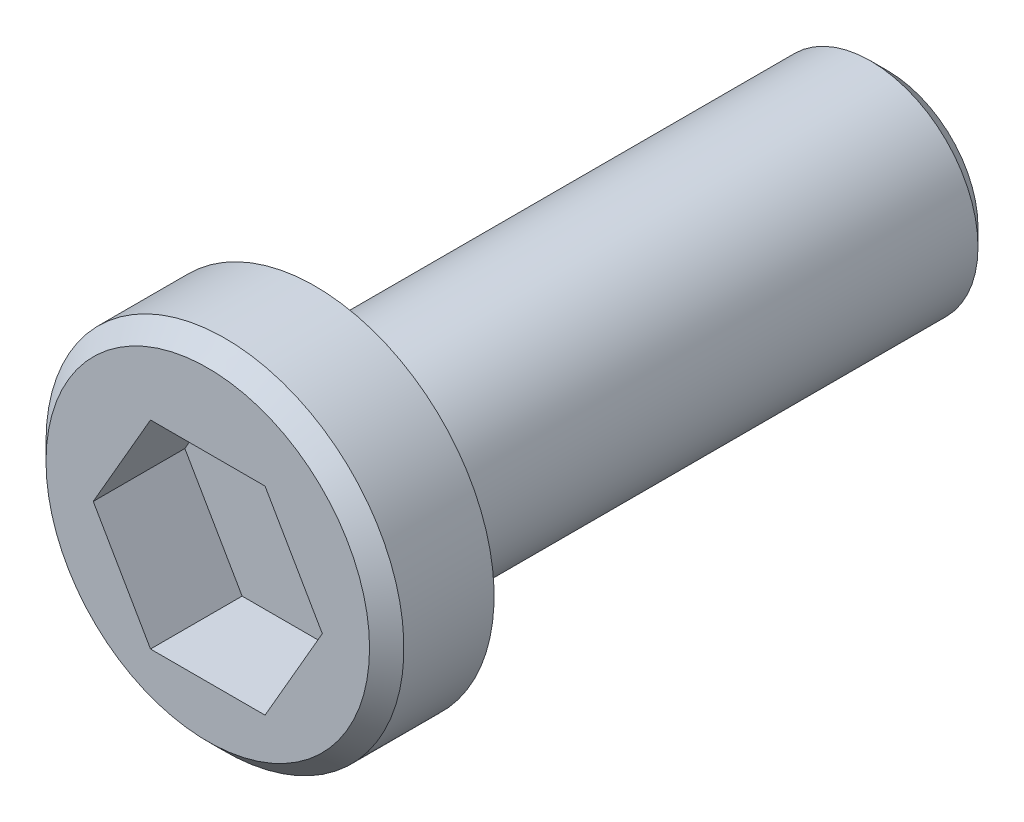
ISO-10303-21;
HEADER;
FILE_DESCRIPTION(('STEP AP214'),'2;1');
FILE_NAME('part.step','',(''),(''),'','','');
FILE_SCHEMA(('AUTOMOTIVE_DESIGN { 1 0 10303 214 1 1 1 1 }'));
ENDSEC;
DATA;
#1=APPLICATION_CONTEXT('core data for automotive mechanical design processes');
#2=APPLICATION_PROTOCOL_DEFINITION('international standard','automotive_design',2000,#1);
#3=PRODUCT_CONTEXT('',#1,'mechanical');
#4=PRODUCT('Part','Part','',(#3));
#5=PRODUCT_RELATED_PRODUCT_CATEGORY('part','',(#4));
#6=PRODUCT_DEFINITION_FORMATION('','',#4);
#7=PRODUCT_DEFINITION_CONTEXT('part definition',#1,'design');
#8=PRODUCT_DEFINITION('design','',#6,#7);
#9=PRODUCT_DEFINITION_SHAPE('','',#8);
#10=(LENGTH_UNIT() NAMED_UNIT(*) SI_UNIT(.MILLI.,.METRE.));
#11=(NAMED_UNIT(*) PLANE_ANGLE_UNIT() SI_UNIT($,.RADIAN.));
#12=(NAMED_UNIT(*) SI_UNIT($,.STERADIAN.) SOLID_ANGLE_UNIT());
#13=UNCERTAINTY_MEASURE_WITH_UNIT(LENGTH_MEASURE(1.E-05),#10,'distance_accuracy_value','');
#14=(GEOMETRIC_REPRESENTATION_CONTEXT(3) GLOBAL_UNCERTAINTY_ASSIGNED_CONTEXT((#13)) GLOBAL_UNIT_ASSIGNED_CONTEXT((#10,
#11,#12)) REPRESENTATION_CONTEXT('',''));
#15=CARTESIAN_POINT('',(0.,0.,0.));
#16=DIRECTION('',(0.,0.,1.));
#17=DIRECTION('',(1.,0.,0.));
#18=AXIS2_PLACEMENT_3D('',#15,#16,#17);
#19=CARTESIAN_POINT('',(0.,0.,25.4));
#20=DIRECTION('',(0.,0.,-1.));
#21=DIRECTION('',(-1.,0.,0.));
#22=AXIS2_PLACEMENT_3D('',#19,#20,#21);
#23=CYLINDRICAL_SURFACE('',#22,4.7625);
#24=CARTESIAN_POINT('',(0.,0.,0.761999999999999));
#25=DIRECTION('',(0.,0.,1.));
#26=DIRECTION('',(1.,0.,0.));
#27=AXIS2_PLACEMENT_3D('',#24,#25,#26);
#28=CIRCLE('',#27,4.7625);
#29=CARTESIAN_POINT('',(4.7625,0.,0.761999999999999));
#30=VERTEX_POINT('',#29);
#31=EDGE_CURVE('E147',#30,#30,#28,.T.);
#32=ORIENTED_EDGE('',*,*,#31,.T.);
#33=EDGE_LOOP('',(#32));
#34=FACE_BOUND('',#33,.T.);
#35=CARTESIAN_POINT('',(0.,0.,25.4));
#36=DIRECTION('',(0.,0.,1.));
#37=DIRECTION('',(1.,0.,0.));
#38=AXIS2_PLACEMENT_3D('',#35,#36,#37);
#39=CIRCLE('',#38,4.7625);
#40=CARTESIAN_POINT('',(4.7625,0.,25.4));
#41=VERTEX_POINT('',#40);
#42=EDGE_CURVE('E144',#41,#41,#39,.T.);
#43=ORIENTED_EDGE('',*,*,#42,.F.);
#44=EDGE_LOOP('',(#43));
#45=FACE_BOUND('',#44,.T.);
#46=ADVANCED_FACE('F34',(#34,#45),#23,.T.);
#47=CARTESIAN_POINT('',(0.,0.,0.));
#48=DIRECTION('',(0.,0.,1.));
#49=DIRECTION('',(1.,0.,0.));
#50=AXIS2_PLACEMENT_3D('',#47,#48,#49);
#51=PLANE('',#50);
#52=CARTESIAN_POINT('',(0.,0.,0.));
#53=DIRECTION('',(0.,0.,1.));
#54=DIRECTION('',(1.,0.,0.));
#55=AXIS2_PLACEMENT_3D('',#52,#53,#54);
#56=CIRCLE('',#55,4.0005);
#57=CARTESIAN_POINT('',(4.0005,0.,0.));
#58=VERTEX_POINT('',#57);
#59=EDGE_CURVE('E150',#58,#58,#56,.F.);
#60=ORIENTED_EDGE('',*,*,#59,.T.);
#61=EDGE_LOOP('',(#60));
#62=FACE_BOUND('',#61,.T.);
#63=ADVANCED_FACE('F170',(#62),#51,.F.);
#64=CARTESIAN_POINT('',(0.,0.491553117569765,25.4));
#65=DIRECTION('',(0.,0.,1.));
#66=DIRECTION('',(1.,0.,0.));
#67=AXIS2_PLACEMENT_3D('',#64,#65,#66);
#68=PLANE('',#67);
#69=CARTESIAN_POINT('',(0.,0.491553117569765,25.4));
#70=DIRECTION('',(0.,0.,1.));
#71=DIRECTION('',(1.,0.,0.));
#72=AXIS2_PLACEMENT_3D('',#69,#70,#71);
#73=CIRCLE('',#72,7.9375);
#74=CARTESIAN_POINT('',(-7.9375,0.491553117569765,25.4));
#75=VERTEX_POINT('',#74);
#76=EDGE_CURVE('E136',#75,#75,#73,.T.);
#77=ORIENTED_EDGE('',*,*,#76,.F.);
#78=EDGE_LOOP('',(#77));
#79=FACE_BOUND('',#78,.T.);
#80=ORIENTED_EDGE('',*,*,#42,.T.);
#81=EDGE_LOOP('',(#80));
#82=FACE_BOUND('',#81,.T.);
#83=ADVANCED_FACE('F176',(#79,#82),#68,.F.);
#84=CARTESIAN_POINT('',(0.,0.491553117569765,30.1625));
#85=DIRECTION('',(0.,0.,-1.));
#86=DIRECTION('',(-1.,0.,0.));
#87=AXIS2_PLACEMENT_3D('',#84,#85,#86);
#88=CYLINDRICAL_SURFACE('',#87,7.9375);
#89=CARTESIAN_POINT('',(0.,0.491553117569765,29.4005));
#90=DIRECTION('',(0.,0.,1.));
#91=DIRECTION('',(1.,0.,0.));
#92=AXIS2_PLACEMENT_3D('',#89,#90,#91);
#93=CIRCLE('',#92,7.9375);
#94=CARTESIAN_POINT('',(-7.9375,0.491553117569765,29.4005));
#95=VERTEX_POINT('',#94);
#96=EDGE_CURVE('E11',#95,#95,#93,.F.);
#97=CARTESIAN_POINT('',(-7.9375,0.491553117569765,29.4005));
#98=CARTESIAN_POINT('',(-7.9375,0.491553117569765,29.358828125));
#99=CARTESIAN_POINT('',(-7.9375,0.491553117569765,29.31715625));
#100=CARTESIAN_POINT('',(-7.9375,0.491553117569765,29.2338125));
#101=CARTESIAN_POINT('',(-7.9375,0.491553117569765,29.192140625));
#102=CARTESIAN_POINT('',(-7.9375,0.491553117569765,29.108796875));
#103=CARTESIAN_POINT('',(-7.9375,0.491553117569765,29.067125));
#104=CARTESIAN_POINT('',(-7.9375,0.491553117569765,28.98378125));
#105=CARTESIAN_POINT('',(-7.9375,0.491553117569765,28.942109375));
#106=CARTESIAN_POINT('',(-7.9375,0.491553117569765,28.858765625));
#107=CARTESIAN_POINT('',(-7.9375,0.491553117569765,28.81709375));
#108=CARTESIAN_POINT('',(-7.9375,0.491553117569765,28.73375));
#109=CARTESIAN_POINT('',(-7.9375,0.491553117569765,28.692078125));
#110=CARTESIAN_POINT('',(-7.9375,0.491553117569765,28.608734375));
#111=CARTESIAN_POINT('',(-7.9375,0.491553117569765,28.5670625));
#112=CARTESIAN_POINT('',(-7.9375,0.491553117569765,28.48371875));
#113=CARTESIAN_POINT('',(-7.9375,0.491553117569765,28.442046875));
#114=CARTESIAN_POINT('',(-7.9375,0.491553117569765,28.358703125));
#115=CARTESIAN_POINT('',(-7.9375,0.491553117569765,28.31703125));
#116=CARTESIAN_POINT('',(-7.9375,0.491553117569765,28.2336875));
#117=CARTESIAN_POINT('',(-7.9375,0.491553117569765,28.192015625));
#118=CARTESIAN_POINT('',(-7.9375,0.491553117569765,28.108671875));
#119=CARTESIAN_POINT('',(-7.9375,0.491553117569765,28.067));
#120=CARTESIAN_POINT('',(-7.9375,0.491553117569765,27.98365625));
#121=CARTESIAN_POINT('',(-7.9375,0.491553117569765,27.941984375));
#122=CARTESIAN_POINT('',(-7.9375,0.491553117569765,27.858640625));
#123=CARTESIAN_POINT('',(-7.9375,0.491553117569765,27.81696875));
#124=CARTESIAN_POINT('',(-7.9375,0.491553117569765,27.733625));
#125=CARTESIAN_POINT('',(-7.9375,0.491553117569765,27.691953125));
#126=CARTESIAN_POINT('',(-7.9375,0.491553117569765,27.608609375));
#127=CARTESIAN_POINT('',(-7.9375,0.491553117569765,27.5669375));
#128=CARTESIAN_POINT('',(-7.9375,0.491553117569765,27.48359375));
#129=CARTESIAN_POINT('',(-7.9375,0.491553117569765,27.441921875));
#130=CARTESIAN_POINT('',(-7.9375,0.491553117569765,27.358578125));
#131=CARTESIAN_POINT('',(-7.9375,0.491553117569765,27.31690625));
#132=CARTESIAN_POINT('',(-7.9375,0.491553117569765,27.2335625));
#133=CARTESIAN_POINT('',(-7.9375,0.491553117569765,27.191890625));
#134=CARTESIAN_POINT('',(-7.9375,0.491553117569765,27.108546875));
#135=CARTESIAN_POINT('',(-7.9375,0.491553117569765,27.066875));
#136=CARTESIAN_POINT('',(-7.9375,0.491553117569765,26.98353125));
#137=CARTESIAN_POINT('',(-7.9375,0.491553117569765,26.941859375));
#138=CARTESIAN_POINT('',(-7.9375,0.491553117569765,26.858515625));
#139=CARTESIAN_POINT('',(-7.9375,0.491553117569765,26.81684375));
#140=CARTESIAN_POINT('',(-7.9375,0.491553117569765,26.7335));
#141=CARTESIAN_POINT('',(-7.9375,0.491553117569765,26.691828125));
#142=CARTESIAN_POINT('',(-7.9375,0.491553117569765,26.608484375));
#143=CARTESIAN_POINT('',(-7.9375,0.491553117569765,26.5668125));
#144=CARTESIAN_POINT('',(-7.9375,0.491553117569765,26.48346875));
#145=CARTESIAN_POINT('',(-7.9375,0.491553117569765,26.441796875));
#146=CARTESIAN_POINT('',(-7.9375,0.491553117569765,26.358453125));
#147=CARTESIAN_POINT('',(-7.9375,0.491553117569765,26.31678125));
#148=CARTESIAN_POINT('',(-7.9375,0.491553117569765,26.2334375));
#149=CARTESIAN_POINT('',(-7.9375,0.491553117569765,26.191765625));
#150=CARTESIAN_POINT('',(-7.9375,0.491553117569765,26.108421875));
#151=CARTESIAN_POINT('',(-7.9375,0.491553117569765,26.06675));
#152=CARTESIAN_POINT('',(-7.9375,0.491553117569765,25.98340625));
#153=CARTESIAN_POINT('',(-7.9375,0.491553117569765,25.941734375));
#154=CARTESIAN_POINT('',(-7.9375,0.491553117569765,25.858390625));
#155=CARTESIAN_POINT('',(-7.9375,0.491553117569765,25.81671875));
#156=CARTESIAN_POINT('',(-7.9375,0.491553117569765,25.733375));
#157=CARTESIAN_POINT('',(-7.9375,0.491553117569765,25.691703125));
#158=CARTESIAN_POINT('',(-7.9375,0.491553117569765,25.608359375));
#159=CARTESIAN_POINT('',(-7.9375,0.491553117569765,25.5666875));
#160=CARTESIAN_POINT('',(-7.9375,0.491553117569765,25.48334375));
#161=CARTESIAN_POINT('',(-7.9375,0.491553117569765,25.441671875));
#162=CARTESIAN_POINT('',(-7.9375,0.491553117569765,25.4));
#163=B_SPLINE_CURVE_WITH_KNOTS('',3,(#97,#98,#99,#100,#101,#102,#103,#104,#105,#106,#107,#108,
#109,#110,#111,#112,#113,#114,#115,#116,#117,#118,#119,#120,#121,#122,#123,#124,#125,#126,#127,
#128,#129,#130,#131,#132,#133,#134,#135,#136,#137,#138,#139,#140,#141,#142,#143,#144,#145,#146,
#147,#148,#149,#150,#151,#152,#153,#154,#155,#156,#157,#158,#159,#160,#161,#162),.UNSPECIFIED.,
.F.,.F.,(4,2,2,2,2,2,2,2,2,2,2,2,2,2,2,2,2,2,2,2,2,2,2,2,2,2,2,2,2,2,2,2,4),(0.,
0.125015624999999,0.250031249999998,0.375046874999996,0.500062499999999,0.625078124999998,
0.750093749999996,0.875109374999999,1.000125,1.125140625,1.25015625,1.375171875,1.5001875,
1.625203125,1.75021875,1.875234375,2.00025,2.125265625,2.25028125,2.375296875,2.5003125,
2.625328125,2.75034375,2.875359375,3.000375,3.125390625,3.25040625,3.375421875,3.5004375,
3.625453125,3.75046875,3.875484375,4.0005),.UNSPECIFIED.);
#164=EDGE_CURVE('BSEAM181',#95,#75,#163,.T.);
#165=ORIENTED_EDGE('',*,*,#96,.T.);
#166=ORIENTED_EDGE('',*,*,#76,.T.);
#167=ORIENTED_EDGE('',*,*,#164,.T.);
#168=ORIENTED_EDGE('',*,*,#164,.F.);
#169=EDGE_LOOP('',(#165,#167,#166,#168));
#170=FACE_BOUND('',#169,.T.);
#171=ADVANCED_FACE('F181',(#170),#88,.T.);
#172=CARTESIAN_POINT('',(0.,0.491553117569765,30.1625));
#173=DIRECTION('',(0.,0.,1.));
#174=DIRECTION('',(1.,0.,0.));
#175=AXIS2_PLACEMENT_3D('',#172,#173,#174);
#176=PLANE('',#175);
#177=DIRECTION('',(0.499999999999999,0.866025403784439,0.));
#178=VECTOR('',#177,1.);
#179=CARTESIAN_POINT('',(2.54,-4.39940905122495,30.1625));
#180=LINE('',#179,#178);
#181=CARTESIAN_POINT('',(2.54,-4.39940905122495,30.1625));
#182=VERTEX_POINT('',#181);
#183=CARTESIAN_POINT('',(5.08,0.,30.1625));
#184=VERTEX_POINT('',#183);
#185=EDGE_CURVE('E49',#182,#184,#180,.T.);
#186=ORIENTED_EDGE('',*,*,#185,.F.);
#187=DIRECTION('',(1.,0.,0.));
#188=VECTOR('',#187,1.);
#189=CARTESIAN_POINT('',(-2.54,-4.39940905122495,30.1625));
#190=LINE('',#189,#188);
#191=CARTESIAN_POINT('',(-2.54,-4.39940905122495,30.1625));
#192=VERTEX_POINT('',#191);
#193=EDGE_CURVE('E132',#192,#182,#190,.T.);
#194=ORIENTED_EDGE('',*,*,#193,.F.);
#195=DIRECTION('',(0.5,-0.866025403784438,0.));
#196=VECTOR('',#195,1.);
#197=CARTESIAN_POINT('',(-5.08,0.,30.1625));
#198=LINE('',#197,#196);
#199=CARTESIAN_POINT('',(-5.08,0.,30.1625));
#200=VERTEX_POINT('',#199);
#201=EDGE_CURVE('E130',#200,#192,#198,.T.);
#202=ORIENTED_EDGE('',*,*,#201,.F.);
#203=DIRECTION('',(-0.5,-0.866025403784439,0.));
#204=VECTOR('',#203,1.);
#205=CARTESIAN_POINT('',(-2.54,4.39940905122495,30.1625));
#206=LINE('',#205,#204);
#207=CARTESIAN_POINT('',(-2.54,4.39940905122495,30.1625));
#208=VERTEX_POINT('',#207);
#209=EDGE_CURVE('E97',#208,#200,#206,.T.);
#210=ORIENTED_EDGE('',*,*,#209,.F.);
#211=DIRECTION('',(-1.,0.,0.));
#212=VECTOR('',#211,1.);
#213=CARTESIAN_POINT('',(2.54,4.39940905122495,30.1625));
#214=LINE('',#213,#212);
#215=CARTESIAN_POINT('',(2.54,4.39940905122495,30.1625));
#216=VERTEX_POINT('',#215);
#217=EDGE_CURVE('E126',#216,#208,#214,.T.);
#218=ORIENTED_EDGE('',*,*,#217,.F.);
#219=DIRECTION('',(-0.5,0.866025403784438,0.));
#220=VECTOR('',#219,1.);
#221=CARTESIAN_POINT('',(5.08,0.,30.1625));
#222=LINE('',#221,#220);
#223=EDGE_CURVE('E123',#184,#216,#222,.T.);
#224=ORIENTED_EDGE('',*,*,#223,.F.);
#225=EDGE_LOOP('',(#186,#194,#202,#210,#218,#224));
#226=FACE_BOUND('',#225,.T.);
#227=CARTESIAN_POINT('',(0.,0.491553117569765,30.1625));
#228=DIRECTION('',(0.,0.,1.));
#229=DIRECTION('',(1.,0.,0.));
#230=AXIS2_PLACEMENT_3D('',#227,#228,#229);
#231=CIRCLE('',#230,7.1755);
#232=CARTESIAN_POINT('',(7.1755,0.491553117569765,30.1625));
#233=VERTEX_POINT('',#232);
#234=EDGE_CURVE('E42',#233,#233,#231,.T.);
#235=ORIENTED_EDGE('',*,*,#234,.T.);
#236=EDGE_LOOP('',(#235));
#237=FACE_BOUND('',#236,.T.);
#238=ADVANCED_FACE('F155',(#226,#237),#176,.T.);
#239=CARTESIAN_POINT('',(0.,0.,0.761999999999999));
#240=DIRECTION('',(0.,0.,1.));
#241=DIRECTION('',(1.,0.,0.));
#242=AXIS2_PLACEMENT_3D('',#239,#240,#241);
#243=CONICAL_SURFACE('',#242,4.7625,0.78539816339745);
#244=ORIENTED_EDGE('',*,*,#59,.F.);
#245=EDGE_LOOP('',(#244));
#246=FACE_BOUND('',#245,.T.);
#247=ORIENTED_EDGE('',*,*,#31,.F.);
#248=EDGE_LOOP('',(#247));
#249=FACE_BOUND('',#248,.T.);
#250=ADVANCED_FACE('F159',(#246,#249),#243,.T.);
#251=CARTESIAN_POINT('',(0.,0.491553117569765,30.1625));
#252=DIRECTION('',(0.,0.,-1.));
#253=DIRECTION('',(-1.,0.,0.));
#254=AXIS2_PLACEMENT_3D('',#251,#252,#253);
#255=CONICAL_SURFACE('',#254,7.1755,0.785398163397444);
#256=ORIENTED_EDGE('',*,*,#96,.F.);
#257=EDGE_LOOP('',(#256));
#258=FACE_BOUND('',#257,.T.);
#259=ORIENTED_EDGE('',*,*,#234,.F.);
#260=EDGE_LOOP('',(#259));
#261=FACE_BOUND('',#260,.T.);
#262=ADVANCED_FACE('F36',(#258,#261),#255,.T.);
#263=CARTESIAN_POINT('',(2.54,-4.39940905122495,26.0985));
#264=DIRECTION('',(0.866025403784439,-0.5,0.));
#265=DIRECTION('',(0.5,0.866025403784439,0.));
#266=AXIS2_PLACEMENT_3D('',#263,#264,#265);
#267=PLANE('',#266);
#268=ORIENTED_EDGE('',*,*,#185,.T.);
#269=DIRECTION('',(0.,0.,1.));
#270=VECTOR('',#269,1.);
#271=CARTESIAN_POINT('',(5.08,0.,26.0985));
#272=LINE('',#271,#270);
#273=CARTESIAN_POINT('',(5.08,0.,26.0985));
#274=VERTEX_POINT('',#273);
#275=EDGE_CURVE('E79',#274,#184,#272,.T.);
#276=ORIENTED_EDGE('',*,*,#275,.F.);
#277=DIRECTION('',(0.499999999999999,0.866025403784439,0.));
#278=VECTOR('',#277,1.);
#279=CARTESIAN_POINT('',(2.54,-4.39940905122495,26.0985));
#280=LINE('',#279,#278);
#281=CARTESIAN_POINT('',(2.54,-4.39940905122495,26.0985));
#282=VERTEX_POINT('',#281);
#283=EDGE_CURVE('E134',#282,#274,#280,.T.);
#284=ORIENTED_EDGE('',*,*,#283,.F.);
#285=DIRECTION('',(0.,0.,1.));
#286=VECTOR('',#285,1.);
#287=CARTESIAN_POINT('',(2.54,-4.39940905122495,26.0985));
#288=LINE('',#287,#286);
#289=EDGE_CURVE('E57',#282,#182,#288,.T.);
#290=ORIENTED_EDGE('',*,*,#289,.T.);
#291=EDGE_LOOP('',(#268,#276,#284,#290));
#292=FACE_BOUND('',#291,.T.);
#293=ADVANCED_FACE('F158',(#292),#267,.F.);
#294=CARTESIAN_POINT('',(-2.54,-4.39940905122495,26.0985));
#295=DIRECTION('',(0.,-1.,0.));
#296=DIRECTION('',(1.,0.,0.));
#297=AXIS2_PLACEMENT_3D('',#294,#295,#296);
#298=PLANE('',#297);
#299=ORIENTED_EDGE('',*,*,#193,.T.);
#300=ORIENTED_EDGE('',*,*,#289,.F.);
#301=DIRECTION('',(1.,0.,0.));
#302=VECTOR('',#301,1.);
#303=CARTESIAN_POINT('',(-2.54,-4.39940905122495,26.0985));
#304=LINE('',#303,#302);
#305=CARTESIAN_POINT('',(-2.54,-4.39940905122495,26.0985));
#306=VERTEX_POINT('',#305);
#307=EDGE_CURVE('E109',#306,#282,#304,.T.);
#308=ORIENTED_EDGE('',*,*,#307,.F.);
#309=DIRECTION('',(0.,0.,1.));
#310=VECTOR('',#309,1.);
#311=CARTESIAN_POINT('',(-2.54,-4.39940905122495,26.0985));
#312=LINE('',#311,#310);
#313=EDGE_CURVE('E101',#306,#192,#312,.T.);
#314=ORIENTED_EDGE('',*,*,#313,.T.);
#315=EDGE_LOOP('',(#299,#300,#308,#314));
#316=FACE_BOUND('',#315,.T.);
#317=ADVANCED_FACE('F165',(#316),#298,.F.);
#318=CARTESIAN_POINT('',(-5.08,0.,26.0985));
#319=DIRECTION('',(-0.866025403784439,-0.5,0.));
#320=DIRECTION('',(0.5,-0.866025403784439,0.));
#321=AXIS2_PLACEMENT_3D('',#318,#319,#320);
#322=PLANE('',#321);
#323=ORIENTED_EDGE('',*,*,#201,.T.);
#324=ORIENTED_EDGE('',*,*,#313,.F.);
#325=DIRECTION('',(0.5,-0.866025403784438,0.));
#326=VECTOR('',#325,1.);
#327=CARTESIAN_POINT('',(-5.08,0.,26.0985));
#328=LINE('',#327,#326);
#329=CARTESIAN_POINT('',(-5.08,0.,26.0985));
#330=VERTEX_POINT('',#329);
#331=EDGE_CURVE('E105',#330,#306,#328,.T.);
#332=ORIENTED_EDGE('',*,*,#331,.F.);
#333=DIRECTION('',(0.,0.,1.));
#334=VECTOR('',#333,1.);
#335=CARTESIAN_POINT('',(-5.08,0.,26.0985));
#336=LINE('',#335,#334);
#337=EDGE_CURVE('E90',#330,#200,#336,.T.);
#338=ORIENTED_EDGE('',*,*,#337,.T.);
#339=EDGE_LOOP('',(#323,#324,#332,#338));
#340=FACE_BOUND('',#339,.T.);
#341=ADVANCED_FACE('F106',(#340),#322,.F.);
#342=CARTESIAN_POINT('',(-2.54,4.39940905122495,26.0985));
#343=DIRECTION('',(-0.866025403784439,0.5,0.));
#344=DIRECTION('',(-0.5,-0.866025403784439,0.));
#345=AXIS2_PLACEMENT_3D('',#342,#343,#344);
#346=PLANE('',#345);
#347=ORIENTED_EDGE('',*,*,#209,.T.);
#348=ORIENTED_EDGE('',*,*,#337,.F.);
#349=DIRECTION('',(-0.5,-0.866025403784439,0.));
#350=VECTOR('',#349,1.);
#351=CARTESIAN_POINT('',(-2.54,4.39940905122495,26.0985));
#352=LINE('',#351,#350);
#353=CARTESIAN_POINT('',(-2.54,4.39940905122495,26.0985));
#354=VERTEX_POINT('',#353);
#355=EDGE_CURVE('E94',#354,#330,#352,.T.);
#356=ORIENTED_EDGE('',*,*,#355,.F.);
#357=DIRECTION('',(0.,0.,1.));
#358=VECTOR('',#357,1.);
#359=CARTESIAN_POINT('',(-2.54,4.39940905122495,26.0985));
#360=LINE('',#359,#358);
#361=EDGE_CURVE('E102',#354,#208,#360,.T.);
#362=ORIENTED_EDGE('',*,*,#361,.T.);
#363=EDGE_LOOP('',(#347,#348,#356,#362));
#364=FACE_BOUND('',#363,.T.);
#365=ADVANCED_FACE('F92',(#364),#346,.F.);
#366=CARTESIAN_POINT('',(2.54,4.39940905122495,26.0985));
#367=DIRECTION('',(0.,1.,0.));
#368=DIRECTION('',(0.,0.,1.));
#369=AXIS2_PLACEMENT_3D('',#366,#367,#368);
#370=PLANE('',#369);
#371=ORIENTED_EDGE('',*,*,#217,.T.);
#372=ORIENTED_EDGE('',*,*,#361,.F.);
#373=DIRECTION('',(-1.,0.,0.));
#374=VECTOR('',#373,1.);
#375=CARTESIAN_POINT('',(2.54,4.39940905122495,26.0985));
#376=LINE('',#375,#374);
#377=CARTESIAN_POINT('',(2.54,4.39940905122495,26.0985));
#378=VERTEX_POINT('',#377);
#379=EDGE_CURVE('E115',#378,#354,#376,.T.);
#380=ORIENTED_EDGE('',*,*,#379,.F.);
#381=DIRECTION('',(0.,0.,1.));
#382=VECTOR('',#381,1.);
#383=CARTESIAN_POINT('',(2.54,4.39940905122495,26.0985));
#384=LINE('',#383,#382);
#385=EDGE_CURVE('E139',#378,#216,#384,.T.);
#386=ORIENTED_EDGE('',*,*,#385,.T.);
#387=EDGE_LOOP('',(#371,#372,#380,#386));
#388=FACE_BOUND('',#387,.T.);
#389=ADVANCED_FACE('F194',(#388),#370,.F.);
#390=CARTESIAN_POINT('',(5.08,0.,26.0985));
#391=DIRECTION('',(0.866025403784438,0.5,0.));
#392=DIRECTION('',(-0.5,0.866025403784439,0.));
#393=AXIS2_PLACEMENT_3D('',#390,#391,#392);
#394=PLANE('',#393);
#395=ORIENTED_EDGE('',*,*,#223,.T.);
#396=ORIENTED_EDGE('',*,*,#385,.F.);
#397=DIRECTION('',(-0.5,0.866025403784438,0.));
#398=VECTOR('',#397,1.);
#399=CARTESIAN_POINT('',(5.08,0.,26.0985));
#400=LINE('',#399,#398);
#401=EDGE_CURVE('E117',#274,#378,#400,.T.);
#402=ORIENTED_EDGE('',*,*,#401,.F.);
#403=ORIENTED_EDGE('',*,*,#275,.T.);
#404=EDGE_LOOP('',(#395,#396,#402,#403));
#405=FACE_BOUND('',#404,.T.);
#406=ADVANCED_FACE('F191',(#405),#394,.F.);
#407=CARTESIAN_POINT('',(7.62,4.39940905122495,26.0985));
#408=DIRECTION('',(0.,0.,1.));
#409=DIRECTION('',(1.,0.,0.));
#410=AXIS2_PLACEMENT_3D('',#407,#408,#409);
#411=PLANE('',#410);
#412=ORIENTED_EDGE('',*,*,#283,.T.);
#413=ORIENTED_EDGE('',*,*,#401,.T.);
#414=ORIENTED_EDGE('',*,*,#379,.T.);
#415=ORIENTED_EDGE('',*,*,#355,.T.);
#416=ORIENTED_EDGE('',*,*,#331,.T.);
#417=ORIENTED_EDGE('',*,*,#307,.T.);
#418=EDGE_LOOP('',(#412,#413,#414,#415,#416,#417));
#419=FACE_BOUND('',#418,.T.);
#420=ADVANCED_FACE('F112',(#419),#411,.T.);
#421=CLOSED_SHELL('',(#46,#63,#83,#171,#238,#250,#262,#293,#317,#341,#365,#389,#406,#420));
#422=MANIFOLD_SOLID_BREP('B2',#421);
#423=ADVANCED_BREP_SHAPE_REPRESENTATION('',(#18,#422),#14);
#424=SHAPE_DEFINITION_REPRESENTATION(#9,#423);
ENDSEC;
END-ISO-10303-21;
